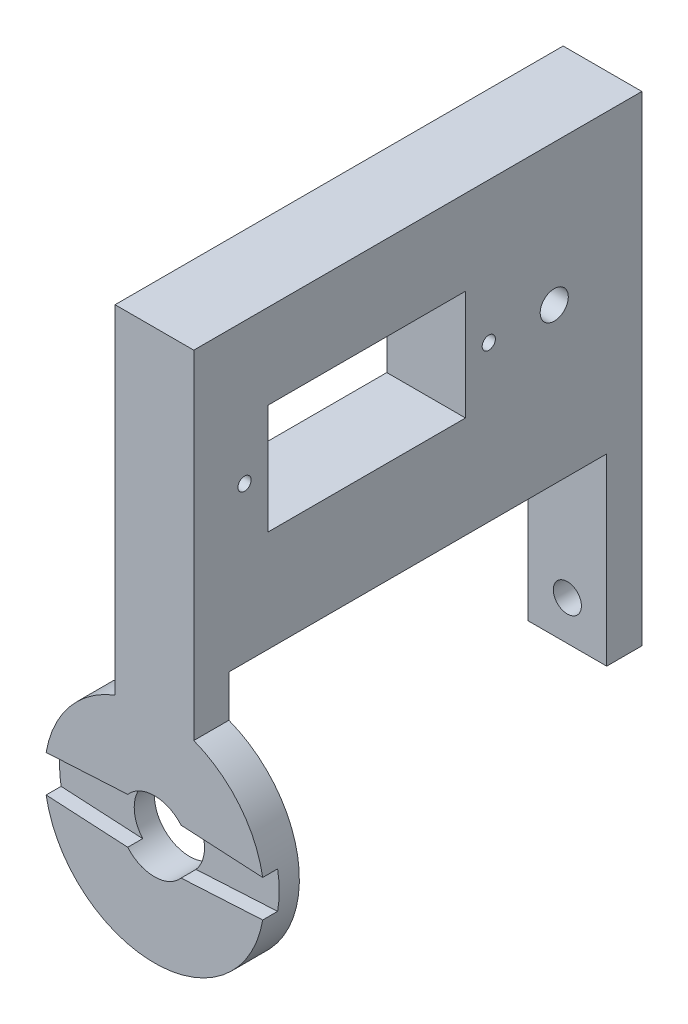
ISO-10303-21;
HEADER;
FILE_DESCRIPTION(('STEP AP214'),'2;1');
FILE_NAME('part.step','',(''),(''),'','','');
FILE_SCHEMA(('AUTOMOTIVE_DESIGN { 1 0 10303 214 1 1 1 1 }'));
ENDSEC;
DATA;
#1=APPLICATION_CONTEXT('core data for automotive mechanical design processes');
#2=APPLICATION_PROTOCOL_DEFINITION('international standard','automotive_design',2000,#1);
#3=PRODUCT_CONTEXT('',#1,'mechanical');
#4=PRODUCT('Part','Part','',(#3));
#5=PRODUCT_RELATED_PRODUCT_CATEGORY('part','',(#4));
#6=PRODUCT_DEFINITION_FORMATION('','',#4);
#7=PRODUCT_DEFINITION_CONTEXT('part definition',#1,'design');
#8=PRODUCT_DEFINITION('design','',#6,#7);
#9=PRODUCT_DEFINITION_SHAPE('','',#8);
#10=(LENGTH_UNIT() NAMED_UNIT(*) SI_UNIT(.MILLI.,.METRE.));
#11=(NAMED_UNIT(*) PLANE_ANGLE_UNIT() SI_UNIT($,.RADIAN.));
#12=(NAMED_UNIT(*) SI_UNIT($,.STERADIAN.) SOLID_ANGLE_UNIT());
#13=UNCERTAINTY_MEASURE_WITH_UNIT(LENGTH_MEASURE(1.E-05),#10,'distance_accuracy_value','');
#14=(GEOMETRIC_REPRESENTATION_CONTEXT(3) GLOBAL_UNCERTAINTY_ASSIGNED_CONTEXT((#13)) GLOBAL_UNIT_ASSIGNED_CONTEXT((#10,
#11,#12)) REPRESENTATION_CONTEXT('',''));
#15=CARTESIAN_POINT('',(0.,0.,0.));
#16=DIRECTION('',(0.,0.,1.));
#17=DIRECTION('',(1.,0.,0.));
#18=AXIS2_PLACEMENT_3D('',#15,#16,#17);
#19=CARTESIAN_POINT('',(4.47918831210979,16.4302514289233,-51.));
#20=DIRECTION('',(0.,1.,0.));
#21=DIRECTION('',(0.,0.,1.));
#22=AXIS2_PLACEMENT_3D('',#19,#20,#21);
#23=PLANE('',#22);
#24=DIRECTION('',(-1.,0.,0.));
#25=VECTOR('',#24,1.);
#26=CARTESIAN_POINT('',(4.47918831210979,16.4302514289233,-47.));
#27=LINE('',#26,#25);
#28=CARTESIAN_POINT('',(4.47918831210979,16.4302514289233,-47.));
#29=VERTEX_POINT('',#28);
#30=CARTESIAN_POINT('',(-4.47918831211599,16.4302514289233,-47.));
#31=VERTEX_POINT('',#30);
#32=EDGE_CURVE('E64',#29,#31,#27,.T.);
#33=ORIENTED_EDGE('',*,*,#32,.F.);
#34=DIRECTION('',(0.,0.,1.));
#35=VECTOR('',#34,1.);
#36=CARTESIAN_POINT('',(4.47918831210979,16.4302514289233,-51.));
#37=LINE('',#36,#35);
#38=CARTESIAN_POINT('',(4.47918831211599,16.4302514289233,-4.));
#39=VERTEX_POINT('',#38);
#40=EDGE_CURVE('E272',#29,#39,#37,.T.);
#41=ORIENTED_EDGE('',*,*,#40,.T.);
#42=DIRECTION('',(-1.,0.,0.));
#43=VECTOR('',#42,1.);
#44=CARTESIAN_POINT('',(4.47918831210979,16.4302514289233,-4.));
#45=LINE('',#44,#43);
#46=CARTESIAN_POINT('',(-4.47918831211599,16.4302514289233,-4.));
#47=VERTEX_POINT('',#46);
#48=EDGE_CURVE('E263',#39,#47,#45,.T.);
#49=ORIENTED_EDGE('',*,*,#48,.T.);
#50=DIRECTION('',(0.,0.,1.));
#51=VECTOR('',#50,1.);
#52=CARTESIAN_POINT('',(-4.47918831211599,16.4302514289233,-51.));
#53=LINE('',#52,#51);
#54=EDGE_CURVE('E189',#31,#47,#53,.T.);
#55=ORIENTED_EDGE('',*,*,#54,.F.);
#56=EDGE_LOOP('',(#33,#41,#49,#55));
#57=FACE_BOUND('',#56,.T.);
#58=ADVANCED_FACE('F39',(#57),#23,.F.);
#59=CARTESIAN_POINT('',(0.,0.,-4.));
#60=DIRECTION('',(0.,0.,1.));
#61=DIRECTION('',(1.,0.,0.));
#62=AXIS2_PLACEMENT_3D('',#59,#60,#61);
#63=PLANE('',#62);
#64=CARTESIAN_POINT('',(0.,0.,-4.));
#65=DIRECTION('',(0.,0.,1.));
#66=DIRECTION('',(1.,0.,0.));
#67=AXIS2_PLACEMENT_3D('',#64,#65,#66);
#68=CIRCLE('',#67,4.);
#69=CARTESIAN_POINT('',(4.,0.,-4.));
#70=VERTEX_POINT('',#69);
#71=EDGE_CURVE('E330',#70,#70,#68,.T.);
#72=ORIENTED_EDGE('',*,*,#71,.T.);
#73=EDGE_LOOP('',(#72));
#74=FACE_BOUND('',#73,.T.);
#75=ORIENTED_EDGE('',*,*,#48,.F.);
#76=DIRECTION('',(0.,1.,0.));
#77=VECTOR('',#76,1.);
#78=CARTESIAN_POINT('',(4.47918831211599,40.5,-4.));
#79=LINE('',#78,#77);
#80=CARTESIAN_POINT('',(4.47918831211599,11.6699131129843,-4.));
#81=VERTEX_POINT('',#80);
#82=EDGE_CURVE('E274',#81,#39,#79,.T.);
#83=ORIENTED_EDGE('',*,*,#82,.F.);
#84=CARTESIAN_POINT('',(0.,0.,-4.));
#85=DIRECTION('',(0.,0.,1.));
#86=DIRECTION('',(1.,0.,0.));
#87=AXIS2_PLACEMENT_3D('',#84,#85,#86);
#88=CIRCLE('',#87,12.5);
#89=CARTESIAN_POINT('',(-4.47918831211599,11.6699131129843,-4.));
#90=VERTEX_POINT('',#89);
#91=EDGE_CURVE('E340',#90,#81,#88,.T.);
#92=ORIENTED_EDGE('',*,*,#91,.F.);
#93=DIRECTION('',(0.,-1.,0.));
#94=VECTOR('',#93,1.);
#95=CARTESIAN_POINT('',(-4.47918831211599,40.5,-4.));
#96=LINE('',#95,#94);
#97=EDGE_CURVE('E280',#47,#90,#96,.T.);
#98=ORIENTED_EDGE('',*,*,#97,.F.);
#99=EDGE_LOOP('',(#75,#83,#92,#98));
#100=FACE_BOUND('',#99,.T.);
#101=ADVANCED_FACE('F385',(#74,#100),#63,.F.);
#102=CARTESIAN_POINT('',(0.,0.,0.));
#103=DIRECTION('',(0.,0.,1.));
#104=DIRECTION('',(1.,0.,0.));
#105=AXIS2_PLACEMENT_3D('',#102,#103,#104);
#106=PLANE('',#105);
#107=CARTESIAN_POINT('',(0.,0.,0.));
#108=DIRECTION('',(0.,0.,1.));
#109=DIRECTION('',(1.,0.,0.));
#110=AXIS2_PLACEMENT_3D('',#107,#108,#109);
#111=CIRCLE('',#110,12.5);
#112=CARTESIAN_POINT('',(12.3232185652271,2.09482318911209,0.));
#113=VERTEX_POINT('',#112);
#114=CARTESIAN_POINT('',(4.47918831211599,11.6699131129843,0.));
#115=VERTEX_POINT('',#114);
#116=EDGE_CURVE('E338',#113,#115,#111,.T.);
#117=ORIENTED_EDGE('',*,*,#116,.T.);
#118=DIRECTION('',(0.,1.,0.));
#119=VECTOR('',#118,1.);
#120=CARTESIAN_POINT('',(4.47918831211599,40.5,0.));
#121=LINE('',#120,#119);
#122=CARTESIAN_POINT('',(4.47918831211599,50.1521075494741,0.));
#123=VERTEX_POINT('',#122);
#124=EDGE_CURVE('E271',#115,#123,#121,.T.);
#125=ORIENTED_EDGE('',*,*,#124,.T.);
#126=DIRECTION('',(1.,0.,0.));
#127=VECTOR('',#126,1.);
#128=CARTESIAN_POINT('',(-4.47918830788401,50.1521075494741,0.));
#129=LINE('',#128,#127);
#130=CARTESIAN_POINT('',(-4.47918830788401,50.1521075494741,0.));
#131=VERTEX_POINT('',#130);
#132=EDGE_CURVE('E199',#131,#123,#129,.T.);
#133=ORIENTED_EDGE('',*,*,#132,.F.);
#134=DIRECTION('',(0.,-1.,0.));
#135=VECTOR('',#134,1.);
#136=CARTESIAN_POINT('',(-4.47918831211599,40.5,0.));
#137=LINE('',#136,#135);
#138=CARTESIAN_POINT('',(-4.47918831211599,11.6699131129843,0.));
#139=VERTEX_POINT('',#138);
#140=EDGE_CURVE('E205',#131,#139,#137,.T.);
#141=ORIENTED_EDGE('',*,*,#140,.T.);
#142=CARTESIAN_POINT('',(-12.3232185652271,2.09482318911209,0.));
#143=VERTEX_POINT('',#142);
#144=EDGE_CURVE('E344',#139,#143,#111,.T.);
#145=ORIENTED_EDGE('',*,*,#144,.T.);
#146=DIRECTION('',(-0.998495668558358,-0.0548306471801791,0.));
#147=VECTOR('',#146,1.);
#148=CARTESIAN_POINT('',(-14.05,2.,0.));
#149=LINE('',#148,#147);
#150=CARTESIAN_POINT('',(-3.03559294084751,2.60483694258907,0.));
#151=VERTEX_POINT('',#150);
#152=EDGE_CURVE('E305',#151,#143,#149,.T.);
#153=ORIENTED_EDGE('',*,*,#152,.F.);
#154=CARTESIAN_POINT('',(0.,0.,0.));
#155=DIRECTION('',(0.,0.,1.));
#156=DIRECTION('',(1.,0.,0.));
#157=AXIS2_PLACEMENT_3D('',#154,#155,#156);
#158=CIRCLE('',#157,4.);
#159=CARTESIAN_POINT('',(3.03559294084751,2.60483694258907,0.));
#160=VERTEX_POINT('',#159);
#161=EDGE_CURVE('E331',#160,#151,#158,.T.);
#162=ORIENTED_EDGE('',*,*,#161,.F.);
#163=DIRECTION('',(-0.998495668558358,0.0548306471801791,0.));
#164=VECTOR('',#163,1.);
#165=CARTESIAN_POINT('',(14.05,2.,0.));
#166=LINE('',#165,#164);
#167=EDGE_CURVE('E287',#113,#160,#166,.T.);
#168=ORIENTED_EDGE('',*,*,#167,.F.);
#169=EDGE_LOOP('',(#117,#125,#133,#141,#145,#153,#162,#168));
#170=FACE_BOUND('',#169,.T.);
#171=ADVANCED_FACE('F389',(#170),#106,.T.);
#172=CARTESIAN_POINT('',(0.,0.,-4.));
#173=DIRECTION('',(0.,0.,1.));
#174=DIRECTION('',(1.,0.,0.));
#175=AXIS2_PLACEMENT_3D('',#172,#173,#174);
#176=CYLINDRICAL_SURFACE('',#175,12.5);
#177=DIRECTION('',(0.,0.,1.));
#178=VECTOR('',#177,1.);
#179=CARTESIAN_POINT('',(4.47918831211599,11.6699131129843,-4.));
#180=LINE('',#179,#178);
#181=EDGE_CURVE('E284',#115,#81,#180,.F.);
#182=ORIENTED_EDGE('',*,*,#181,.F.);
#183=ORIENTED_EDGE('',*,*,#116,.F.);
#184=DIRECTION('',(0.,0.,1.));
#185=VECTOR('',#184,1.);
#186=CARTESIAN_POINT('',(12.3232185652271,2.09482318911209,-4.));
#187=LINE('',#186,#185);
#188=CARTESIAN_POINT('',(12.3232185652271,2.09482318911209,-1.7));
#189=VERTEX_POINT('',#188);
#190=EDGE_CURVE('E322',#189,#113,#187,.T.);
#191=ORIENTED_EDGE('',*,*,#190,.F.);
#192=CARTESIAN_POINT('',(0.,0.,-1.7));
#193=DIRECTION('',(0.,0.,1.));
#194=DIRECTION('',(1.,0.,0.));
#195=AXIS2_PLACEMENT_3D('',#192,#193,#194);
#196=CIRCLE('',#195,12.5);
#197=CARTESIAN_POINT('',(12.3232185652271,-2.09482318911209,-1.7));
#198=VERTEX_POINT('',#197);
#199=EDGE_CURVE('E309',#189,#198,#196,.F.);
#200=ORIENTED_EDGE('',*,*,#199,.T.);
#201=DIRECTION('',(0.,0.,1.));
#202=VECTOR('',#201,1.);
#203=CARTESIAN_POINT('',(12.3232185652271,-2.09482318911209,-4.));
#204=LINE('',#203,#202);
#205=CARTESIAN_POINT('',(12.3232185652271,-2.09482318911209,0.));
#206=VERTEX_POINT('',#205);
#207=EDGE_CURVE('E327',#206,#198,#204,.F.);
#208=ORIENTED_EDGE('',*,*,#207,.F.);
#209=CARTESIAN_POINT('',(-12.3232185652271,-2.09482318911209,0.));
#210=VERTEX_POINT('',#209);
#211=EDGE_CURVE('E335',#210,#206,#111,.T.);
#212=ORIENTED_EDGE('',*,*,#211,.F.);
#213=DIRECTION('',(0.,0.,1.));
#214=VECTOR('',#213,1.);
#215=CARTESIAN_POINT('',(-12.3232185652271,-2.0948231891121,-4.));
#216=LINE('',#215,#214);
#217=CARTESIAN_POINT('',(-12.3232185652271,-2.09482318911209,-1.7));
#218=VERTEX_POINT('',#217);
#219=EDGE_CURVE('E323',#218,#210,#216,.T.);
#220=ORIENTED_EDGE('',*,*,#219,.F.);
#221=CARTESIAN_POINT('',(-12.3232185652271,2.09482318911209,-1.7));
#222=VERTEX_POINT('',#221);
#223=EDGE_CURVE('E318',#218,#222,#196,.F.);
#224=ORIENTED_EDGE('',*,*,#223,.T.);
#225=DIRECTION('',(0.,0.,1.));
#226=VECTOR('',#225,1.);
#227=CARTESIAN_POINT('',(-12.3232185652271,2.09482318911209,-4.));
#228=LINE('',#227,#226);
#229=EDGE_CURVE('E324',#143,#222,#228,.F.);
#230=ORIENTED_EDGE('',*,*,#229,.F.);
#231=ORIENTED_EDGE('',*,*,#144,.F.);
#232=DIRECTION('',(0.,0.,1.));
#233=VECTOR('',#232,1.);
#234=CARTESIAN_POINT('',(-4.47918831211599,11.6699131129843,-4.));
#235=LINE('',#234,#233);
#236=EDGE_CURVE('E276',#90,#139,#235,.T.);
#237=ORIENTED_EDGE('',*,*,#236,.F.);
#238=ORIENTED_EDGE('',*,*,#91,.T.);
#239=EDGE_LOOP('',(#182,#183,#191,#200,#208,#212,#220,#224,#230,#231,#237,#238));
#240=FACE_BOUND('',#239,.T.);
#241=ADVANCED_FACE('F41',(#240),#176,.T.);
#242=DIRECTION('',(0.998495668558358,-0.0548306471801789,0.));
#243=VECTOR('',#242,1.);
#244=CARTESIAN_POINT('',(-14.05,-2.,0.));
#245=LINE('',#244,#243);
#246=CARTESIAN_POINT('',(-3.03559294084751,-2.60483694258907,0.));
#247=VERTEX_POINT('',#246);
#248=EDGE_CURVE('E304',#210,#247,#245,.T.);
#249=ORIENTED_EDGE('',*,*,#248,.F.);
#250=ORIENTED_EDGE('',*,*,#211,.T.);
#251=DIRECTION('',(0.998495668558358,0.0548306471801793,0.));
#252=VECTOR('',#251,1.);
#253=CARTESIAN_POINT('',(14.05,-2.,0.));
#254=LINE('',#253,#252);
#255=CARTESIAN_POINT('',(3.03559294084751,-2.60483694258907,0.));
#256=VERTEX_POINT('',#255);
#257=EDGE_CURVE('E293',#256,#206,#254,.T.);
#258=ORIENTED_EDGE('',*,*,#257,.F.);
#259=EDGE_CURVE('E328',#247,#256,#158,.T.);
#260=ORIENTED_EDGE('',*,*,#259,.F.);
#261=EDGE_LOOP('',(#249,#250,#258,#260));
#262=FACE_BOUND('',#261,.T.);
#263=ADVANCED_FACE('F423',(#262),#106,.T.);
#264=CARTESIAN_POINT('',(0.,0.,-4.));
#265=DIRECTION('',(0.,0.,1.));
#266=DIRECTION('',(1.,0.,0.));
#267=AXIS2_PLACEMENT_3D('',#264,#265,#266);
#268=CYLINDRICAL_SURFACE('',#267,4.);
#269=DIRECTION('',(0.,0.,1.));
#270=VECTOR('',#269,1.);
#271=CARTESIAN_POINT('',(3.03559294084751,-2.60483694258907,-1.7));
#272=LINE('',#271,#270);
#273=CARTESIAN_POINT('',(3.03559294084751,-2.60483694258907,-1.7));
#274=VERTEX_POINT('',#273);
#275=EDGE_CURVE('E308',#274,#256,#272,.T.);
#276=ORIENTED_EDGE('',*,*,#275,.F.);
#277=CARTESIAN_POINT('',(0.,0.,-1.7));
#278=DIRECTION('',(0.,0.,1.));
#279=DIRECTION('',(1.,0.,0.));
#280=AXIS2_PLACEMENT_3D('',#277,#278,#279);
#281=CIRCLE('',#280,4.);
#282=CARTESIAN_POINT('',(3.03559294084751,2.60483694258907,-1.7));
#283=VERTEX_POINT('',#282);
#284=EDGE_CURVE('E339',#283,#274,#281,.F.);
#285=ORIENTED_EDGE('',*,*,#284,.F.);
#286=DIRECTION('',(0.,0.,1.));
#287=VECTOR('',#286,1.);
#288=CARTESIAN_POINT('',(3.03559294084751,2.60483694258907,-1.7));
#289=LINE('',#288,#287);
#290=EDGE_CURVE('E297',#283,#160,#289,.T.);
#291=ORIENTED_EDGE('',*,*,#290,.T.);
#292=ORIENTED_EDGE('',*,*,#161,.T.);
#293=DIRECTION('',(0.,0.,1.));
#294=VECTOR('',#293,1.);
#295=CARTESIAN_POINT('',(-3.03559294084751,2.60483694258907,-1.7));
#296=LINE('',#295,#294);
#297=CARTESIAN_POINT('',(-3.03559294084751,2.60483694258907,-1.7));
#298=VERTEX_POINT('',#297);
#299=EDGE_CURVE('E313',#298,#151,#296,.T.);
#300=ORIENTED_EDGE('',*,*,#299,.F.);
#301=CARTESIAN_POINT('',(-3.03559294084751,-2.60483694258907,-1.7));
#302=VERTEX_POINT('',#301);
#303=EDGE_CURVE('E343',#302,#298,#281,.F.);
#304=ORIENTED_EDGE('',*,*,#303,.F.);
#305=DIRECTION('',(0.,0.,1.));
#306=VECTOR('',#305,1.);
#307=CARTESIAN_POINT('',(-3.03559294084751,-2.60483694258907,-1.7));
#308=LINE('',#307,#306);
#309=EDGE_CURVE('E311',#302,#247,#308,.T.);
#310=ORIENTED_EDGE('',*,*,#309,.T.);
#311=ORIENTED_EDGE('',*,*,#259,.T.);
#312=EDGE_LOOP('',(#276,#285,#291,#292,#300,#304,#310,#311));
#313=FACE_BOUND('',#312,.T.);
#314=ORIENTED_EDGE('',*,*,#71,.F.);
#315=EDGE_LOOP('',(#314));
#316=FACE_BOUND('',#315,.T.);
#317=ADVANCED_FACE('F416',(#313,#316),#268,.F.);
#318=CARTESIAN_POINT('',(14.05,0.,-1.7));
#319=DIRECTION('',(0.,0.,1.));
#320=DIRECTION('',(1.,0.,0.));
#321=AXIS2_PLACEMENT_3D('',#318,#319,#320);
#322=PLANE('',#321);
#323=DIRECTION('',(-0.998495668558358,0.0548306471801791,0.));
#324=VECTOR('',#323,1.);
#325=CARTESIAN_POINT('',(14.05,2.,-1.7));
#326=LINE('',#325,#324);
#327=EDGE_CURVE('E289',#189,#283,#326,.T.);
#328=ORIENTED_EDGE('',*,*,#327,.T.);
#329=ORIENTED_EDGE('',*,*,#284,.T.);
#330=DIRECTION('',(0.998495668558358,0.0548306471801793,0.));
#331=VECTOR('',#330,1.);
#332=CARTESIAN_POINT('',(14.05,-2.,-1.7));
#333=LINE('',#332,#331);
#334=EDGE_CURVE('E300',#274,#198,#333,.T.);
#335=ORIENTED_EDGE('',*,*,#334,.T.);
#336=ORIENTED_EDGE('',*,*,#199,.F.);
#337=EDGE_LOOP('',(#328,#329,#335,#336));
#338=FACE_BOUND('',#337,.T.);
#339=ADVANCED_FACE('F403',(#338),#322,.T.);
#340=CARTESIAN_POINT('',(14.05,2.,-1.7));
#341=DIRECTION('',(0.0548306471801791,0.998495668558358,0.));
#342=DIRECTION('',(-0.998495668558358,0.0548306471801791,0.));
#343=AXIS2_PLACEMENT_3D('',#340,#341,#342);
#344=PLANE('',#343);
#345=ORIENTED_EDGE('',*,*,#190,.T.);
#346=ORIENTED_EDGE('',*,*,#167,.T.);
#347=ORIENTED_EDGE('',*,*,#290,.F.);
#348=ORIENTED_EDGE('',*,*,#327,.F.);
#349=EDGE_LOOP('',(#345,#346,#347,#348));
#350=FACE_BOUND('',#349,.T.);
#351=ADVANCED_FACE('F409',(#350),#344,.F.);
#352=CARTESIAN_POINT('',(14.05,-2.,-1.7));
#353=DIRECTION('',(0.0548306471801793,-0.998495668558358,0.));
#354=DIRECTION('',(0.998495668558358,0.0548306471801793,0.));
#355=AXIS2_PLACEMENT_3D('',#352,#353,#354);
#356=PLANE('',#355);
#357=ORIENTED_EDGE('',*,*,#207,.T.);
#358=ORIENTED_EDGE('',*,*,#334,.F.);
#359=ORIENTED_EDGE('',*,*,#275,.T.);
#360=ORIENTED_EDGE('',*,*,#257,.T.);
#361=EDGE_LOOP('',(#357,#358,#359,#360));
#362=FACE_BOUND('',#361,.T.);
#363=ADVANCED_FACE('F401',(#362),#356,.F.);
#364=DIRECTION('',(0.998495668558358,-0.0548306471801789,0.));
#365=VECTOR('',#364,1.);
#366=CARTESIAN_POINT('',(-14.05,-2.,-1.7));
#367=LINE('',#366,#365);
#368=EDGE_CURVE('E295',#218,#302,#367,.T.);
#369=ORIENTED_EDGE('',*,*,#368,.T.);
#370=ORIENTED_EDGE('',*,*,#303,.T.);
#371=DIRECTION('',(-0.998495668558358,-0.0548306471801791,0.));
#372=VECTOR('',#371,1.);
#373=CARTESIAN_POINT('',(-14.05,2.,-1.7));
#374=LINE('',#373,#372);
#375=EDGE_CURVE('E288',#298,#222,#374,.T.);
#376=ORIENTED_EDGE('',*,*,#375,.T.);
#377=ORIENTED_EDGE('',*,*,#223,.F.);
#378=EDGE_LOOP('',(#369,#370,#376,#377));
#379=FACE_BOUND('',#378,.T.);
#380=ADVANCED_FACE('F396',(#379),#322,.T.);
#381=CARTESIAN_POINT('',(-14.05,-2.,-1.7));
#382=DIRECTION('',(-0.0548306471801789,-0.998495668558358,0.));
#383=DIRECTION('',(0.998495668558358,-0.0548306471801789,0.));
#384=AXIS2_PLACEMENT_3D('',#381,#382,#383);
#385=PLANE('',#384);
#386=ORIENTED_EDGE('',*,*,#219,.T.);
#387=ORIENTED_EDGE('',*,*,#248,.T.);
#388=ORIENTED_EDGE('',*,*,#309,.F.);
#389=ORIENTED_EDGE('',*,*,#368,.F.);
#390=EDGE_LOOP('',(#386,#387,#388,#389));
#391=FACE_BOUND('',#390,.T.);
#392=ADVANCED_FACE('F405',(#391),#385,.F.);
#393=CARTESIAN_POINT('',(-14.05,2.,-1.7));
#394=DIRECTION('',(-0.0548306471801792,0.998495668558358,0.));
#395=DIRECTION('',(-0.998495668558358,-0.0548306471801792,0.));
#396=AXIS2_PLACEMENT_3D('',#393,#394,#395);
#397=PLANE('',#396);
#398=ORIENTED_EDGE('',*,*,#229,.T.);
#399=ORIENTED_EDGE('',*,*,#375,.F.);
#400=ORIENTED_EDGE('',*,*,#299,.T.);
#401=ORIENTED_EDGE('',*,*,#152,.T.);
#402=EDGE_LOOP('',(#398,#399,#400,#401));
#403=FACE_BOUND('',#402,.T.);
#404=ADVANCED_FACE('F400',(#403),#397,.F.);
#405=CARTESIAN_POINT('',(4.47918831211599,40.5,-4.));
#406=DIRECTION('',(1.,0.,0.));
#407=DIRECTION('',(0.,1.,0.));
#408=AXIS2_PLACEMENT_3D('',#405,#406,#407);
#409=PLANE('',#408);
#410=DIRECTION('',(0.,0.,-1.));
#411=VECTOR('',#410,1.);
#412=CARTESIAN_POINT('',(4.47918831211599,40.5,0.));
#413=LINE('',#412,#411);
#414=CARTESIAN_POINT('',(4.47918831211599,40.5,-8.42793755391922));
#415=VERTEX_POINT('',#414);
#416=CARTESIAN_POINT('',(4.47918831211599,40.5,-30.9279375539192));
#417=VERTEX_POINT('',#416);
#418=EDGE_CURVE('E208',#415,#417,#413,.T.);
#419=ORIENTED_EDGE('',*,*,#418,.T.);
#420=DIRECTION('',(0.,1.,0.));
#421=VECTOR('',#420,1.);
#422=CARTESIAN_POINT('',(4.47918831211599,28.,-30.9279375539192));
#423=LINE('',#422,#421);
#424=CARTESIAN_POINT('',(4.47918831211599,28.,-30.9279375539192));
#425=VERTEX_POINT('',#424);
#426=EDGE_CURVE('E232',#425,#417,#423,.T.);
#427=ORIENTED_EDGE('',*,*,#426,.F.);
#428=DIRECTION('',(0.,0.,-1.));
#429=VECTOR('',#428,1.);
#430=CARTESIAN_POINT('',(4.47918831211599,28.,-8.42793755391922));
#431=LINE('',#430,#429);
#432=CARTESIAN_POINT('',(4.47918831211599,28.,-8.42793755391922));
#433=VERTEX_POINT('',#432);
#434=EDGE_CURVE('E231',#433,#425,#431,.T.);
#435=ORIENTED_EDGE('',*,*,#434,.F.);
#436=DIRECTION('',(0.,-1.,0.));
#437=VECTOR('',#436,1.);
#438=CARTESIAN_POINT('',(4.47918831211599,28.,-8.42793755391922));
#439=LINE('',#438,#437);
#440=EDGE_CURVE('E229',#415,#433,#439,.T.);
#441=ORIENTED_EDGE('',*,*,#440,.F.);
#442=EDGE_LOOP('',(#419,#427,#435,#441));
#443=FACE_BOUND('',#442,.T.);
#444=CARTESIAN_POINT('',(4.47918831211599,34.0999999999996,-33.5779375539194));
#445=DIRECTION('',(1.,0.,0.));
#446=DIRECTION('',(0.,1.,0.));
#447=AXIS2_PLACEMENT_3D('',#444,#445,#446);
#448=CIRCLE('',#447,0.749999999999999);
#449=CARTESIAN_POINT('',(4.47918831211599,34.8499999999996,-33.5779375539194));
#450=VERTEX_POINT('',#449);
#451=EDGE_CURVE('E221',#450,#450,#448,.T.);
#452=ORIENTED_EDGE('',*,*,#451,.F.);
#453=EDGE_LOOP('',(#452));
#454=FACE_BOUND('',#453,.T.);
#455=CARTESIAN_POINT('',(4.47918831211599,34.0999999999996,-5.77793755391945));
#456=DIRECTION('',(1.,0.,0.));
#457=DIRECTION('',(0.,1.,0.));
#458=AXIS2_PLACEMENT_3D('',#455,#456,#457);
#459=CIRCLE('',#458,0.75);
#460=CARTESIAN_POINT('',(4.47918831211599,34.8499999999996,-5.77793755391945));
#461=VERTEX_POINT('',#460);
#462=EDGE_CURVE('E218',#461,#461,#459,.T.);
#463=ORIENTED_EDGE('',*,*,#462,.F.);
#464=EDGE_LOOP('',(#463));
#465=FACE_BOUND('',#464,.T.);
#466=CARTESIAN_POINT('',(4.47918831211599,34.0999999999996,-41.0279375539199));
#467=DIRECTION('',(1.,0.,0.));
#468=DIRECTION('',(0.,1.,0.));
#469=AXIS2_PLACEMENT_3D('',#466,#467,#468);
#470=CIRCLE('',#469,1.6);
#471=CARTESIAN_POINT('',(4.47918831211599,35.6999999999996,-41.0279375539199));
#472=VERTEX_POINT('',#471);
#473=EDGE_CURVE('E227',#472,#472,#470,.T.);
#474=ORIENTED_EDGE('',*,*,#473,.F.);
#475=EDGE_LOOP('',(#474));
#476=FACE_BOUND('',#475,.T.);
#477=DIRECTION('',(0.,-1.,0.));
#478=VECTOR('',#477,1.);
#479=CARTESIAN_POINT('',(4.47918831210979,16.4302514289233,-51.));
#480=LINE('',#479,#478);
#481=CARTESIAN_POINT('',(4.47918831211599,50.1521075494741,-51.));
#482=VERTEX_POINT('',#481);
#483=CARTESIAN_POINT('',(4.47918831210979,-4.49999999999999,-51.));
#484=VERTEX_POINT('',#483);
#485=EDGE_CURVE('E186',#482,#484,#480,.T.);
#486=ORIENTED_EDGE('',*,*,#485,.F.);
#487=DIRECTION('',(0.,0.,1.));
#488=VECTOR('',#487,1.);
#489=CARTESIAN_POINT('',(4.47918831211599,50.1521075494741,0.));
#490=LINE('',#489,#488);
#491=EDGE_CURVE('E197',#482,#123,#490,.T.);
#492=ORIENTED_EDGE('',*,*,#491,.T.);
#493=ORIENTED_EDGE('',*,*,#124,.F.);
#494=ORIENTED_EDGE('',*,*,#181,.T.);
#495=ORIENTED_EDGE('',*,*,#82,.T.);
#496=ORIENTED_EDGE('',*,*,#40,.F.);
#497=DIRECTION('',(0.,-1.,0.));
#498=VECTOR('',#497,1.);
#499=CARTESIAN_POINT('',(4.47918831210979,40.5,-47.));
#500=LINE('',#499,#498);
#501=CARTESIAN_POINT('',(4.47918831210979,-4.49999999999999,-47.));
#502=VERTEX_POINT('',#501);
#503=EDGE_CURVE('E255',#29,#502,#500,.T.);
#504=ORIENTED_EDGE('',*,*,#503,.T.);
#505=DIRECTION('',(0.,0.,-1.));
#506=VECTOR('',#505,1.);
#507=CARTESIAN_POINT('',(4.47918831210979,-4.49999999999999,-47.));
#508=LINE('',#507,#506);
#509=EDGE_CURVE('E258',#502,#484,#508,.T.);
#510=ORIENTED_EDGE('',*,*,#509,.T.);
#511=EDGE_LOOP('',(#486,#492,#493,#494,#495,#496,#504,#510));
#512=FACE_BOUND('',#511,.T.);
#513=ADVANCED_FACE('F362',(#443,#454,#465,#476,#512),#409,.T.);
#514=CARTESIAN_POINT('',(-4.47918831211599,40.5,-4.));
#515=DIRECTION('',(-1.,0.,0.));
#516=DIRECTION('',(0.,-1.,0.));
#517=AXIS2_PLACEMENT_3D('',#514,#515,#516);
#518=PLANE('',#517);
#519=DIRECTION('',(0.,-1.,0.));
#520=VECTOR('',#519,1.);
#521=CARTESIAN_POINT('',(-4.47918831211599,40.5,-30.9279375539192));
#522=LINE('',#521,#520);
#523=CARTESIAN_POINT('',(-4.47918831211599,40.5,-30.9279375539192));
#524=VERTEX_POINT('',#523);
#525=CARTESIAN_POINT('',(-4.47918831211599,28.,-30.9279375539192));
#526=VERTEX_POINT('',#525);
#527=EDGE_CURVE('E48',#524,#526,#522,.T.);
#528=ORIENTED_EDGE('',*,*,#527,.F.);
#529=DIRECTION('',(0.,0.,-1.));
#530=VECTOR('',#529,1.);
#531=CARTESIAN_POINT('',(-4.47918830788401,40.5,0.));
#532=LINE('',#531,#530);
#533=CARTESIAN_POINT('',(-4.47918830788401,40.5,-8.42793755391922));
#534=VERTEX_POINT('',#533);
#535=EDGE_CURVE('E203',#534,#524,#532,.T.);
#536=ORIENTED_EDGE('',*,*,#535,.F.);
#537=DIRECTION('',(0.,1.,0.));
#538=VECTOR('',#537,1.);
#539=CARTESIAN_POINT('',(-4.47918831211599,40.5,-8.42793755391922));
#540=LINE('',#539,#538);
#541=CARTESIAN_POINT('',(-4.47918831211599,28.,-8.42793755391922));
#542=VERTEX_POINT('',#541);
#543=EDGE_CURVE('E11',#542,#534,#540,.T.);
#544=ORIENTED_EDGE('',*,*,#543,.F.);
#545=DIRECTION('',(0.,0.,1.));
#546=VECTOR('',#545,1.);
#547=CARTESIAN_POINT('',(-4.47918831211599,28.,-4.));
#548=LINE('',#547,#546);
#549=EDGE_CURVE('E347',#526,#542,#548,.T.);
#550=ORIENTED_EDGE('',*,*,#549,.F.);
#551=EDGE_LOOP('',(#528,#536,#544,#550));
#552=FACE_BOUND('',#551,.T.);
#553=CARTESIAN_POINT('',(-4.47918831211599,34.0999999999996,-33.5779375539194));
#554=DIRECTION('',(-1.,0.,0.));
#555=DIRECTION('',(0.,-1.,0.));
#556=AXIS2_PLACEMENT_3D('',#553,#554,#555);
#557=CIRCLE('',#556,0.749999999999999);
#558=CARTESIAN_POINT('',(-4.47918831211599,33.3499999999996,-33.5779375539194));
#559=VERTEX_POINT('',#558);
#560=EDGE_CURVE('E216',#559,#559,#557,.T.);
#561=ORIENTED_EDGE('',*,*,#560,.F.);
#562=EDGE_LOOP('',(#561));
#563=FACE_BOUND('',#562,.T.);
#564=CARTESIAN_POINT('',(-4.47918831211599,34.0999999999996,-5.77793755391945));
#565=DIRECTION('',(-1.,0.,0.));
#566=DIRECTION('',(0.,-1.,0.));
#567=AXIS2_PLACEMENT_3D('',#564,#565,#566);
#568=CIRCLE('',#567,0.75);
#569=CARTESIAN_POINT('',(-4.47918831211599,33.3499999999996,-5.77793755391945));
#570=VERTEX_POINT('',#569);
#571=EDGE_CURVE('E211',#570,#570,#568,.T.);
#572=ORIENTED_EDGE('',*,*,#571,.F.);
#573=EDGE_LOOP('',(#572));
#574=FACE_BOUND('',#573,.T.);
#575=CARTESIAN_POINT('',(-4.47918831211599,34.0999999999996,-41.0279375539199));
#576=DIRECTION('',(-1.,0.,0.));
#577=DIRECTION('',(0.,-1.,0.));
#578=AXIS2_PLACEMENT_3D('',#575,#576,#577);
#579=CIRCLE('',#578,1.6);
#580=CARTESIAN_POINT('',(-4.47918831211599,32.4999999999996,-41.0279375539199));
#581=VERTEX_POINT('',#580);
#582=EDGE_CURVE('E43',#581,#581,#579,.T.);
#583=ORIENTED_EDGE('',*,*,#582,.F.);
#584=EDGE_LOOP('',(#583));
#585=FACE_BOUND('',#584,.T.);
#586=DIRECTION('',(0.,0.,1.));
#587=VECTOR('',#586,1.);
#588=CARTESIAN_POINT('',(-4.47918830788401,50.1521075494741,0.));
#589=LINE('',#588,#587);
#590=CARTESIAN_POINT('',(-4.47918830788401,50.1521075494741,-51.));
#591=VERTEX_POINT('',#590);
#592=EDGE_CURVE('E193',#591,#131,#589,.T.);
#593=ORIENTED_EDGE('',*,*,#592,.F.);
#594=DIRECTION('',(0.,1.,0.));
#595=VECTOR('',#594,1.);
#596=CARTESIAN_POINT('',(-4.47918831211599,16.4302514289233,-51.));
#597=LINE('',#596,#595);
#598=CARTESIAN_POINT('',(-4.47918831211599,-4.49999999999999,-51.));
#599=VERTEX_POINT('',#598);
#600=EDGE_CURVE('E180',#599,#591,#597,.T.);
#601=ORIENTED_EDGE('',*,*,#600,.F.);
#602=DIRECTION('',(0.,0.,-1.));
#603=VECTOR('',#602,1.);
#604=CARTESIAN_POINT('',(-4.47918831211599,-4.49999999999999,-47.));
#605=LINE('',#604,#603);
#606=CARTESIAN_POINT('',(-4.47918831211599,-4.49999999999999,-47.));
#607=VERTEX_POINT('',#606);
#608=EDGE_CURVE('E262',#607,#599,#605,.T.);
#609=ORIENTED_EDGE('',*,*,#608,.F.);
#610=DIRECTION('',(0.,1.,0.));
#611=VECTOR('',#610,1.);
#612=CARTESIAN_POINT('',(-4.47918831211599,40.5,-47.));
#613=LINE('',#612,#611);
#614=EDGE_CURVE('E260',#607,#31,#613,.T.);
#615=ORIENTED_EDGE('',*,*,#614,.T.);
#616=ORIENTED_EDGE('',*,*,#54,.T.);
#617=ORIENTED_EDGE('',*,*,#97,.T.);
#618=ORIENTED_EDGE('',*,*,#236,.T.);
#619=ORIENTED_EDGE('',*,*,#140,.F.);
#620=EDGE_LOOP('',(#593,#601,#609,#615,#616,#617,#618,#619));
#621=FACE_BOUND('',#620,.T.);
#622=ADVANCED_FACE('F200',(#552,#563,#574,#585,#621),#518,.T.);
#623=CARTESIAN_POINT('',(0.,0.,-51.));
#624=DIRECTION('',(0.,0.,1.));
#625=DIRECTION('',(1.,0.,0.));
#626=AXIS2_PLACEMENT_3D('',#623,#624,#625);
#627=PLANE('',#626);
#628=ORIENTED_EDGE('',*,*,#485,.T.);
#629=DIRECTION('',(-1.,0.,0.));
#630=VECTOR('',#629,1.);
#631=CARTESIAN_POINT('',(4.47918831210979,-4.49999999999999,-51.));
#632=LINE('',#631,#630);
#633=EDGE_CURVE('E183',#484,#599,#632,.T.);
#634=ORIENTED_EDGE('',*,*,#633,.T.);
#635=ORIENTED_EDGE('',*,*,#600,.T.);
#636=DIRECTION('',(1.,0.,0.));
#637=VECTOR('',#636,1.);
#638=CARTESIAN_POINT('',(-4.47918830788401,50.1521075494741,-51.));
#639=LINE('',#638,#637);
#640=EDGE_CURVE('E181',#591,#482,#639,.T.);
#641=ORIENTED_EDGE('',*,*,#640,.T.);
#642=EDGE_LOOP('',(#628,#634,#635,#641));
#643=FACE_BOUND('',#642,.T.);
#644=CARTESIAN_POINT('',(0.,0.,-51.));
#645=DIRECTION('',(0.,0.,-1.));
#646=DIRECTION('',(-1.,0.,0.));
#647=AXIS2_PLACEMENT_3D('',#644,#645,#646);
#648=CIRCLE('',#647,1.6);
#649=CARTESIAN_POINT('',(-1.6,0.,-51.));
#650=VERTEX_POINT('',#649);
#651=EDGE_CURVE('E241',#650,#650,#648,.T.);
#652=ORIENTED_EDGE('',*,*,#651,.F.);
#653=EDGE_LOOP('',(#652));
#654=FACE_BOUND('',#653,.T.);
#655=ADVANCED_FACE('F177',(#643,#654),#627,.F.);
#656=CARTESIAN_POINT('',(0.,0.,-47.));
#657=DIRECTION('',(0.,0.,-1.));
#658=DIRECTION('',(-1.,0.,0.));
#659=AXIS2_PLACEMENT_3D('',#656,#657,#658);
#660=PLANE('',#659);
#661=CARTESIAN_POINT('',(0.,0.,-47.));
#662=DIRECTION('',(0.,0.,-1.));
#663=DIRECTION('',(-1.,0.,0.));
#664=AXIS2_PLACEMENT_3D('',#661,#662,#663);
#665=CIRCLE('',#664,1.6);
#666=CARTESIAN_POINT('',(-1.6,0.,-47.));
#667=VERTEX_POINT('',#666);
#668=EDGE_CURVE('E250',#667,#667,#665,.T.);
#669=ORIENTED_EDGE('',*,*,#668,.T.);
#670=EDGE_LOOP('',(#669));
#671=FACE_BOUND('',#670,.T.);
#672=ORIENTED_EDGE('',*,*,#503,.F.);
#673=ORIENTED_EDGE('',*,*,#32,.T.);
#674=ORIENTED_EDGE('',*,*,#614,.F.);
#675=DIRECTION('',(-1.,0.,0.));
#676=VECTOR('',#675,1.);
#677=CARTESIAN_POINT('',(4.47918831210979,-4.49999999999999,-47.));
#678=LINE('',#677,#676);
#679=EDGE_CURVE('E251',#502,#607,#678,.T.);
#680=ORIENTED_EDGE('',*,*,#679,.F.);
#681=EDGE_LOOP('',(#672,#673,#674,#680));
#682=FACE_BOUND('',#681,.T.);
#683=ADVANCED_FACE('F449',(#671,#682),#660,.F.);
#684=CARTESIAN_POINT('',(4.47918831210979,-4.49999999999999,-47.));
#685=DIRECTION('',(0.,-1.,0.));
#686=DIRECTION('',(0.,0.,-1.));
#687=AXIS2_PLACEMENT_3D('',#684,#685,#686);
#688=PLANE('',#687);
#689=ORIENTED_EDGE('',*,*,#633,.F.);
#690=ORIENTED_EDGE('',*,*,#509,.F.);
#691=ORIENTED_EDGE('',*,*,#679,.T.);
#692=ORIENTED_EDGE('',*,*,#608,.T.);
#693=EDGE_LOOP('',(#689,#690,#691,#692));
#694=FACE_BOUND('',#693,.T.);
#695=ADVANCED_FACE('F444',(#694),#688,.T.);
#696=CARTESIAN_POINT('',(0.,0.,-47.));
#697=DIRECTION('',(0.,0.,-1.));
#698=DIRECTION('',(-1.,0.,0.));
#699=AXIS2_PLACEMENT_3D('',#696,#697,#698);
#700=CYLINDRICAL_SURFACE('',#699,1.6);
#701=ORIENTED_EDGE('',*,*,#668,.F.);
#702=EDGE_LOOP('',(#701));
#703=FACE_BOUND('',#702,.T.);
#704=ORIENTED_EDGE('',*,*,#651,.T.);
#705=EDGE_LOOP('',(#704));
#706=FACE_BOUND('',#705,.T.);
#707=ADVANCED_FACE('F451',(#703,#706),#700,.F.);
#708=CARTESIAN_POINT('',(-12.5,28.,-8.42793755391922));
#709=DIRECTION('',(0.,0.,1.));
#710=DIRECTION('',(1.,0.,0.));
#711=AXIS2_PLACEMENT_3D('',#708,#709,#710);
#712=PLANE('',#711);
#713=ORIENTED_EDGE('',*,*,#543,.T.);
#714=DIRECTION('',(1.,0.,0.));
#715=VECTOR('',#714,1.);
#716=CARTESIAN_POINT('',(-12.5,40.5,-8.42793755391922));
#717=LINE('',#716,#715);
#718=EDGE_CURVE('E238',#534,#415,#717,.T.);
#719=ORIENTED_EDGE('',*,*,#718,.T.);
#720=ORIENTED_EDGE('',*,*,#440,.T.);
#721=DIRECTION('',(1.,0.,0.));
#722=VECTOR('',#721,1.);
#723=CARTESIAN_POINT('',(-12.5,28.,-8.42793755391922));
#724=LINE('',#723,#722);
#725=EDGE_CURVE('E240',#542,#433,#724,.T.);
#726=ORIENTED_EDGE('',*,*,#725,.F.);
#727=EDGE_LOOP('',(#713,#719,#720,#726));
#728=FACE_BOUND('',#727,.T.);
#729=ADVANCED_FACE('F359',(#728),#712,.F.);
#730=CARTESIAN_POINT('',(-12.5,28.,-30.9279375539192));
#731=DIRECTION('',(0.,0.,-1.));
#732=DIRECTION('',(-1.,0.,0.));
#733=AXIS2_PLACEMENT_3D('',#730,#731,#732);
#734=PLANE('',#733);
#735=ORIENTED_EDGE('',*,*,#527,.T.);
#736=DIRECTION('',(1.,0.,0.));
#737=VECTOR('',#736,1.);
#738=CARTESIAN_POINT('',(-12.5,28.,-30.9279375539192));
#739=LINE('',#738,#737);
#740=EDGE_CURVE('E54',#526,#425,#739,.T.);
#741=ORIENTED_EDGE('',*,*,#740,.T.);
#742=ORIENTED_EDGE('',*,*,#426,.T.);
#743=DIRECTION('',(1.,0.,0.));
#744=VECTOR('',#743,1.);
#745=CARTESIAN_POINT('',(-12.5,40.5,-30.9279375539192));
#746=LINE('',#745,#744);
#747=EDGE_CURVE('E245',#524,#417,#746,.T.);
#748=ORIENTED_EDGE('',*,*,#747,.F.);
#749=EDGE_LOOP('',(#735,#741,#742,#748));
#750=FACE_BOUND('',#749,.T.);
#751=ADVANCED_FACE('F354',(#750),#734,.F.);
#752=CARTESIAN_POINT('',(-12.5,28.,-8.42793755391922));
#753=DIRECTION('',(0.,-1.,0.));
#754=DIRECTION('',(0.,0.,-1.));
#755=AXIS2_PLACEMENT_3D('',#752,#753,#754);
#756=PLANE('',#755);
#757=ORIENTED_EDGE('',*,*,#549,.T.);
#758=ORIENTED_EDGE('',*,*,#725,.T.);
#759=ORIENTED_EDGE('',*,*,#434,.T.);
#760=ORIENTED_EDGE('',*,*,#740,.F.);
#761=EDGE_LOOP('',(#757,#758,#759,#760));
#762=FACE_BOUND('',#761,.T.);
#763=ADVANCED_FACE('F356',(#762),#756,.F.);
#764=CARTESIAN_POINT('',(-12.5,34.0999999999996,-41.0279375539199));
#765=DIRECTION('',(1.,0.,0.));
#766=DIRECTION('',(0.,1.,0.));
#767=AXIS2_PLACEMENT_3D('',#764,#765,#766);
#768=CYLINDRICAL_SURFACE('',#767,1.6);
#769=ORIENTED_EDGE('',*,*,#582,.T.);
#770=EDGE_LOOP('',(#769));
#771=FACE_BOUND('',#770,.T.);
#772=ORIENTED_EDGE('',*,*,#473,.T.);
#773=EDGE_LOOP('',(#772));
#774=FACE_BOUND('',#773,.T.);
#775=ADVANCED_FACE('F461',(#771,#774),#768,.F.);
#776=CARTESIAN_POINT('',(12.5,34.0999999999996,-5.77793755391945));
#777=DIRECTION('',(-1.,0.,0.));
#778=DIRECTION('',(0.,-1.,0.));
#779=AXIS2_PLACEMENT_3D('',#776,#777,#778);
#780=CYLINDRICAL_SURFACE('',#779,0.75);
#781=ORIENTED_EDGE('',*,*,#462,.T.);
#782=EDGE_LOOP('',(#781));
#783=FACE_BOUND('',#782,.T.);
#784=ORIENTED_EDGE('',*,*,#571,.T.);
#785=EDGE_LOOP('',(#784));
#786=FACE_BOUND('',#785,.T.);
#787=ADVANCED_FACE('F377',(#783,#786),#780,.F.);
#788=CARTESIAN_POINT('',(12.5,34.0999999999996,-33.5779375539194));
#789=DIRECTION('',(-1.,0.,0.));
#790=DIRECTION('',(0.,-1.,0.));
#791=AXIS2_PLACEMENT_3D('',#788,#789,#790);
#792=CYLINDRICAL_SURFACE('',#791,0.749999999999999);
#793=ORIENTED_EDGE('',*,*,#451,.T.);
#794=EDGE_LOOP('',(#793));
#795=FACE_BOUND('',#794,.T.);
#796=ORIENTED_EDGE('',*,*,#560,.T.);
#797=EDGE_LOOP('',(#796));
#798=FACE_BOUND('',#797,.T.);
#799=ADVANCED_FACE('F369',(#795,#798),#792,.F.);
#800=CARTESIAN_POINT('',(-4.47918830788401,40.5,0.));
#801=DIRECTION('',(0.,-1.,0.));
#802=DIRECTION('',(1.,0.,0.));
#803=AXIS2_PLACEMENT_3D('',#800,#801,#802);
#804=PLANE('',#803);
#805=ORIENTED_EDGE('',*,*,#535,.T.);
#806=ORIENTED_EDGE('',*,*,#747,.T.);
#807=ORIENTED_EDGE('',*,*,#418,.F.);
#808=ORIENTED_EDGE('',*,*,#718,.F.);
#809=EDGE_LOOP('',(#805,#806,#807,#808));
#810=FACE_BOUND('',#809,.T.);
#811=ADVANCED_FACE('F368',(#810),#804,.T.);
#812=CARTESIAN_POINT('',(-4.47918830788401,50.1521075494741,0.));
#813=DIRECTION('',(0.,1.,0.));
#814=DIRECTION('',(-1.,0.,0.));
#815=AXIS2_PLACEMENT_3D('',#812,#813,#814);
#816=PLANE('',#815);
#817=ORIENTED_EDGE('',*,*,#491,.F.);
#818=ORIENTED_EDGE('',*,*,#640,.F.);
#819=ORIENTED_EDGE('',*,*,#592,.T.);
#820=ORIENTED_EDGE('',*,*,#132,.T.);
#821=EDGE_LOOP('',(#817,#818,#819,#820));
#822=FACE_BOUND('',#821,.T.);
#823=ADVANCED_FACE('F194',(#822),#816,.T.);
#824=CLOSED_SHELL('',(#58,#101,#171,#241,#263,#317,#339,#351,#363,#380,#392,#404,#513,#622,#655,
#683,#695,#707,#729,#751,#763,#775,#787,#799,#811,#823));
#825=MANIFOLD_SOLID_BREP('B2',#824);
#826=ADVANCED_BREP_SHAPE_REPRESENTATION('',(#18,#825),#14);
#827=SHAPE_DEFINITION_REPRESENTATION(#9,#826);
ENDSEC;
END-ISO-10303-21;
